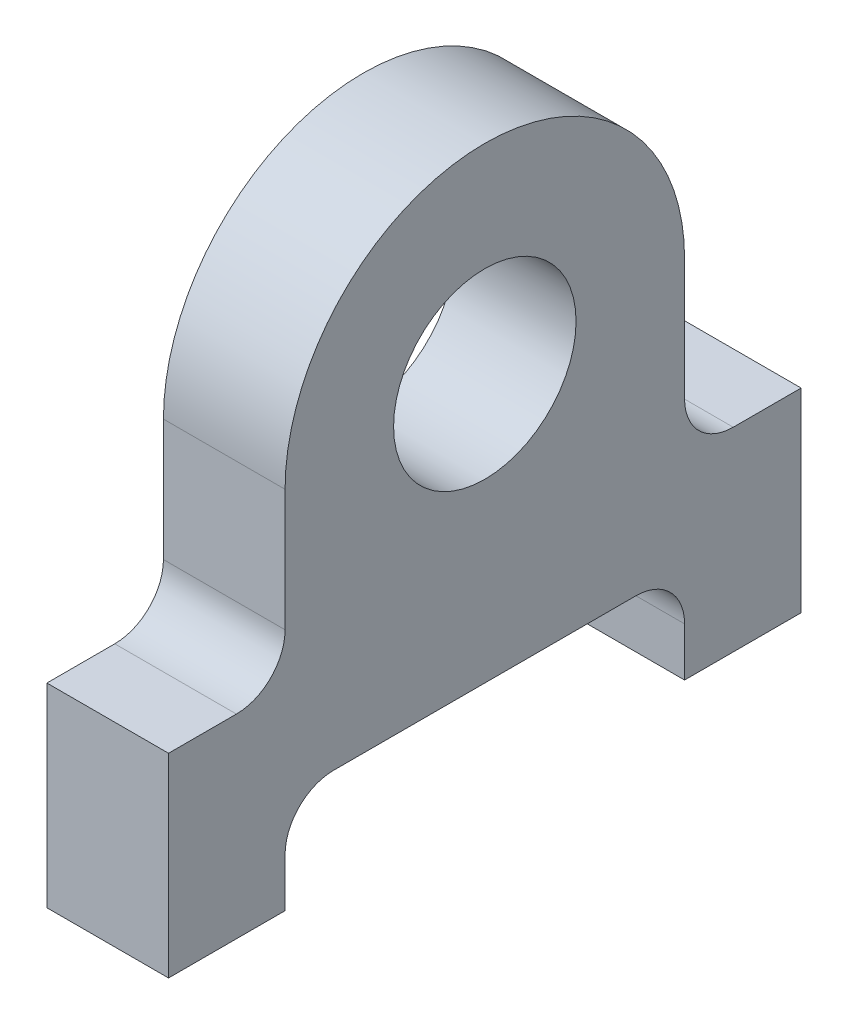
ISO-10303-21;
HEADER;
FILE_DESCRIPTION(('STEP AP214'),'2;1');
FILE_NAME('part.step','',(''),(''),'','','');
FILE_SCHEMA(('AUTOMOTIVE_DESIGN { 1 0 10303 214 1 1 1 1 }'));
ENDSEC;
DATA;
#1=APPLICATION_CONTEXT('core data for automotive mechanical design processes');
#2=APPLICATION_PROTOCOL_DEFINITION('international standard','automotive_design',2000,#1);
#3=PRODUCT_CONTEXT('',#1,'mechanical');
#4=PRODUCT('Part','Part','',(#3));
#5=PRODUCT_RELATED_PRODUCT_CATEGORY('part','',(#4));
#6=PRODUCT_DEFINITION_FORMATION('','',#4);
#7=PRODUCT_DEFINITION_CONTEXT('part definition',#1,'design');
#8=PRODUCT_DEFINITION('design','',#6,#7);
#9=PRODUCT_DEFINITION_SHAPE('','',#8);
#10=(LENGTH_UNIT() NAMED_UNIT(*) SI_UNIT(.MILLI.,.METRE.));
#11=(NAMED_UNIT(*) PLANE_ANGLE_UNIT() SI_UNIT($,.RADIAN.));
#12=(NAMED_UNIT(*) SI_UNIT($,.STERADIAN.) SOLID_ANGLE_UNIT());
#13=UNCERTAINTY_MEASURE_WITH_UNIT(LENGTH_MEASURE(1.E-05),#10,'distance_accuracy_value','');
#14=(GEOMETRIC_REPRESENTATION_CONTEXT(3) GLOBAL_UNCERTAINTY_ASSIGNED_CONTEXT((#13)) GLOBAL_UNIT_ASSIGNED_CONTEXT((#10,
#11,#12)) REPRESENTATION_CONTEXT('',''));
#15=CARTESIAN_POINT('',(0.,0.,0.));
#16=DIRECTION('',(0.,0.,1.));
#17=DIRECTION('',(1.,0.,0.));
#18=AXIS2_PLACEMENT_3D('',#15,#16,#17);
#19=CARTESIAN_POINT('',(6.35,-16.51,7.8867));
#20=DIRECTION('',(-1.,0.,0.));
#21=DIRECTION('',(0.,0.,1.));
#22=AXIS2_PLACEMENT_3D('',#19,#20,#21);
#23=PLANE('',#22);
#24=DIRECTION('',(0.,-1.,0.));
#25=VECTOR('',#24,1.);
#26=CARTESIAN_POINT('',(6.35,-8.89,16.51));
#27=LINE('',#26,#25);
#28=CARTESIAN_POINT('',(6.35,-8.89,16.51));
#29=VERTEX_POINT('',#28);
#30=CARTESIAN_POINT('',(6.35,-19.05,16.51));
#31=VERTEX_POINT('',#30);
#32=EDGE_CURVE('E236',#29,#31,#27,.T.);
#33=ORIENTED_EDGE('',*,*,#32,.T.);
#34=DIRECTION('',(0.,0.,-1.));
#35=VECTOR('',#34,1.);
#36=CARTESIAN_POINT('',(6.35,-19.05,16.51));
#37=LINE('',#36,#35);
#38=CARTESIAN_POINT('',(6.35,-19.05,10.4267));
#39=VERTEX_POINT('',#38);
#40=EDGE_CURVE('E124',#31,#39,#37,.T.);
#41=ORIENTED_EDGE('',*,*,#40,.T.);
#42=DIRECTION('',(0.,1.,0.));
#43=VECTOR('',#42,1.);
#44=CARTESIAN_POINT('',(6.35,-19.05,10.4267));
#45=LINE('',#44,#43);
#46=CARTESIAN_POINT('',(6.35,-16.51,10.4267));
#47=VERTEX_POINT('',#46);
#48=EDGE_CURVE('E289',#39,#47,#45,.T.);
#49=ORIENTED_EDGE('',*,*,#48,.T.);
#50=CARTESIAN_POINT('',(6.35,-16.51,7.8867));
#51=DIRECTION('',(-1.,0.,0.));
#52=DIRECTION('',(0.,0.,1.));
#53=AXIS2_PLACEMENT_3D('',#50,#51,#52);
#54=CIRCLE('',#53,2.54);
#55=CARTESIAN_POINT('',(6.35,-13.97,7.8867));
#56=VERTEX_POINT('',#55);
#57=EDGE_CURVE('E309',#47,#56,#54,.T.);
#58=ORIENTED_EDGE('',*,*,#57,.T.);
#59=DIRECTION('',(0.,0.,-1.));
#60=VECTOR('',#59,1.);
#61=CARTESIAN_POINT('',(6.35,-13.97,7.8867));
#62=LINE('',#61,#60);
#63=CARTESIAN_POINT('',(6.35,-13.97,-7.8867));
#64=VERTEX_POINT('',#63);
#65=EDGE_CURVE('E305',#56,#64,#62,.T.);
#66=ORIENTED_EDGE('',*,*,#65,.T.);
#67=CARTESIAN_POINT('',(6.35,-16.51,-7.8867));
#68=DIRECTION('',(-1.,0.,0.));
#69=DIRECTION('',(0.,0.,-1.));
#70=AXIS2_PLACEMENT_3D('',#67,#68,#69);
#71=CIRCLE('',#70,2.54);
#72=CARTESIAN_POINT('',(6.35,-16.51,-10.4267));
#73=VERTEX_POINT('',#72);
#74=EDGE_CURVE('E308',#64,#73,#71,.T.);
#75=ORIENTED_EDGE('',*,*,#74,.T.);
#76=DIRECTION('',(0.,-1.,0.));
#77=VECTOR('',#76,1.);
#78=CARTESIAN_POINT('',(6.35,-19.05,-10.4267));
#79=LINE('',#78,#77);
#80=CARTESIAN_POINT('',(6.35,-19.05,-10.4267));
#81=VERTEX_POINT('',#80);
#82=EDGE_CURVE('E313',#73,#81,#79,.T.);
#83=ORIENTED_EDGE('',*,*,#82,.T.);
#84=DIRECTION('',(0.,0.,-1.));
#85=VECTOR('',#84,1.);
#86=CARTESIAN_POINT('',(6.35,-19.05,-16.51));
#87=LINE('',#86,#85);
#88=CARTESIAN_POINT('',(6.35,-19.05,-16.51));
#89=VERTEX_POINT('',#88);
#90=EDGE_CURVE('E320',#81,#89,#87,.T.);
#91=ORIENTED_EDGE('',*,*,#90,.T.);
#92=DIRECTION('',(0.,1.,0.));
#93=VECTOR('',#92,1.);
#94=CARTESIAN_POINT('',(6.35,-8.89,-16.51));
#95=LINE('',#94,#93);
#96=CARTESIAN_POINT('',(6.35,-8.89,-16.51));
#97=VERTEX_POINT('',#96);
#98=EDGE_CURVE('E323',#89,#97,#95,.T.);
#99=ORIENTED_EDGE('',*,*,#98,.T.);
#100=DIRECTION('',(0.,0.,1.));
#101=VECTOR('',#100,1.);
#102=CARTESIAN_POINT('',(6.35,-8.89,-12.9667));
#103=LINE('',#102,#101);
#104=CARTESIAN_POINT('',(6.35,-8.89,-12.9667));
#105=VERTEX_POINT('',#104);
#106=EDGE_CURVE('E326',#97,#105,#103,.T.);
#107=ORIENTED_EDGE('',*,*,#106,.T.);
#108=CARTESIAN_POINT('',(6.35,-6.35,-12.9667));
#109=DIRECTION('',(-1.,0.,0.));
#110=DIRECTION('',(0.,0.,-1.));
#111=AXIS2_PLACEMENT_3D('',#108,#109,#110);
#112=CIRCLE('',#111,2.54);
#113=CARTESIAN_POINT('',(6.35,-6.35,-10.4267));
#114=VERTEX_POINT('',#113);
#115=EDGE_CURVE('E329',#105,#114,#112,.T.);
#116=ORIENTED_EDGE('',*,*,#115,.T.);
#117=DIRECTION('',(0.,1.,0.));
#118=VECTOR('',#117,1.);
#119=CARTESIAN_POINT('',(6.35,0.,-10.4267));
#120=LINE('',#119,#118);
#121=CARTESIAN_POINT('',(6.35,0.,-10.4267));
#122=VERTEX_POINT('',#121);
#123=EDGE_CURVE('E332',#114,#122,#120,.T.);
#124=ORIENTED_EDGE('',*,*,#123,.T.);
#125=CARTESIAN_POINT('',(6.35,0.,0.));
#126=DIRECTION('',(1.,0.,0.));
#127=DIRECTION('',(0.,0.,-1.));
#128=AXIS2_PLACEMENT_3D('',#125,#126,#127);
#129=CIRCLE('',#128,10.4267);
#130=CARTESIAN_POINT('',(6.35,0.,10.4267));
#131=VERTEX_POINT('',#130);
#132=EDGE_CURVE('E167',#122,#131,#129,.T.);
#133=ORIENTED_EDGE('',*,*,#132,.T.);
#134=DIRECTION('',(0.,-1.,0.));
#135=VECTOR('',#134,1.);
#136=CARTESIAN_POINT('',(6.35,0.,10.4267));
#137=LINE('',#136,#135);
#138=CARTESIAN_POINT('',(6.35,-6.35,10.4267));
#139=VERTEX_POINT('',#138);
#140=EDGE_CURVE('E161',#131,#139,#137,.T.);
#141=ORIENTED_EDGE('',*,*,#140,.T.);
#142=CARTESIAN_POINT('',(6.35,-6.35,12.9667));
#143=DIRECTION('',(-1.,0.,0.));
#144=DIRECTION('',(0.,0.,1.));
#145=AXIS2_PLACEMENT_3D('',#142,#143,#144);
#146=CIRCLE('',#145,2.54);
#147=CARTESIAN_POINT('',(6.35,-8.89,12.9667));
#148=VERTEX_POINT('',#147);
#149=EDGE_CURVE('E165',#139,#148,#146,.T.);
#150=ORIENTED_EDGE('',*,*,#149,.T.);
#151=DIRECTION('',(0.,0.,1.));
#152=VECTOR('',#151,1.);
#153=CARTESIAN_POINT('',(6.35,-8.89,12.9667));
#154=LINE('',#153,#152);
#155=EDGE_CURVE('E57',#148,#29,#154,.T.);
#156=ORIENTED_EDGE('',*,*,#155,.T.);
#157=EDGE_LOOP('',(#33,#41,#49,#58,#66,#75,#83,#91,#99,#107,#116,#124,#133,#141,#150,#156));
#158=FACE_BOUND('',#157,.T.);
#159=CARTESIAN_POINT('',(6.35,0.,0.));
#160=DIRECTION('',(1.,0.,0.));
#161=DIRECTION('',(0.,0.,1.));
#162=AXIS2_PLACEMENT_3D('',#159,#160,#161);
#163=CIRCLE('',#162,4.7625);
#164=CARTESIAN_POINT('',(6.35,0.,4.7625));
#165=VERTEX_POINT('',#164);
#166=EDGE_CURVE('E194',#165,#165,#163,.T.);
#167=ORIENTED_EDGE('',*,*,#166,.F.);
#168=EDGE_LOOP('',(#167));
#169=FACE_BOUND('',#168,.T.);
#170=ADVANCED_FACE('F39',(#158,#169),#23,.F.);
#171=CARTESIAN_POINT('',(0.,-16.51,7.8867));
#172=DIRECTION('',(-1.,0.,0.));
#173=DIRECTION('',(0.,0.,1.));
#174=AXIS2_PLACEMENT_3D('',#171,#172,#173);
#175=PLANE('',#174);
#176=DIRECTION('',(0.,-1.,0.));
#177=VECTOR('',#176,1.);
#178=CARTESIAN_POINT('',(0.,-8.89,16.51));
#179=LINE('',#178,#177);
#180=CARTESIAN_POINT('',(0.,-8.89,16.51));
#181=VERTEX_POINT('',#180);
#182=CARTESIAN_POINT('',(0.,-19.05,16.51));
#183=VERTEX_POINT('',#182);
#184=EDGE_CURVE('E189',#181,#183,#179,.T.);
#185=ORIENTED_EDGE('',*,*,#184,.F.);
#186=DIRECTION('',(0.,0.,1.));
#187=VECTOR('',#186,1.);
#188=CARTESIAN_POINT('',(0.,-8.89,12.9667));
#189=LINE('',#188,#187);
#190=CARTESIAN_POINT('',(0.,-8.89,12.9667));
#191=VERTEX_POINT('',#190);
#192=EDGE_CURVE('E116',#191,#181,#189,.T.);
#193=ORIENTED_EDGE('',*,*,#192,.F.);
#194=CARTESIAN_POINT('',(0.,-6.35,12.9667));
#195=DIRECTION('',(-1.,0.,0.));
#196=DIRECTION('',(0.,0.,1.));
#197=AXIS2_PLACEMENT_3D('',#194,#195,#196);
#198=CIRCLE('',#197,2.54);
#199=CARTESIAN_POINT('',(0.,-6.35,10.4267));
#200=VERTEX_POINT('',#199);
#201=EDGE_CURVE('E110',#200,#191,#198,.T.);
#202=ORIENTED_EDGE('',*,*,#201,.F.);
#203=DIRECTION('',(0.,-1.,0.));
#204=VECTOR('',#203,1.);
#205=CARTESIAN_POINT('',(0.,0.,10.4267));
#206=LINE('',#205,#204);
#207=CARTESIAN_POINT('',(0.,0.,10.4267));
#208=VERTEX_POINT('',#207);
#209=EDGE_CURVE('E176',#208,#200,#206,.T.);
#210=ORIENTED_EDGE('',*,*,#209,.F.);
#211=CARTESIAN_POINT('',(0.,0.,0.));
#212=DIRECTION('',(1.,0.,0.));
#213=DIRECTION('',(0.,0.,-1.));
#214=AXIS2_PLACEMENT_3D('',#211,#212,#213);
#215=CIRCLE('',#214,10.4267);
#216=CARTESIAN_POINT('',(0.,0.,-10.4267));
#217=VERTEX_POINT('',#216);
#218=EDGE_CURVE('E227',#217,#208,#215,.T.);
#219=ORIENTED_EDGE('',*,*,#218,.F.);
#220=DIRECTION('',(0.,1.,0.));
#221=VECTOR('',#220,1.);
#222=CARTESIAN_POINT('',(0.,0.,-10.4267));
#223=LINE('',#222,#221);
#224=CARTESIAN_POINT('',(0.,-6.35,-10.4267));
#225=VERTEX_POINT('',#224);
#226=EDGE_CURVE('E224',#225,#217,#223,.T.);
#227=ORIENTED_EDGE('',*,*,#226,.F.);
#228=CARTESIAN_POINT('',(0.,-6.35,-12.9667));
#229=DIRECTION('',(-1.,0.,0.));
#230=DIRECTION('',(0.,0.,-1.));
#231=AXIS2_PLACEMENT_3D('',#228,#229,#230);
#232=CIRCLE('',#231,2.54);
#233=CARTESIAN_POINT('',(0.,-8.89,-12.9667));
#234=VERTEX_POINT('',#233);
#235=EDGE_CURVE('E221',#234,#225,#232,.T.);
#236=ORIENTED_EDGE('',*,*,#235,.F.);
#237=DIRECTION('',(0.,0.,1.));
#238=VECTOR('',#237,1.);
#239=CARTESIAN_POINT('',(0.,-8.89,-12.9667));
#240=LINE('',#239,#238);
#241=CARTESIAN_POINT('',(0.,-8.89,-16.51));
#242=VERTEX_POINT('',#241);
#243=EDGE_CURVE('E218',#242,#234,#240,.T.);
#244=ORIENTED_EDGE('',*,*,#243,.F.);
#245=DIRECTION('',(0.,1.,0.));
#246=VECTOR('',#245,1.);
#247=CARTESIAN_POINT('',(0.,-8.89,-16.51));
#248=LINE('',#247,#246);
#249=CARTESIAN_POINT('',(0.,-19.05,-16.51));
#250=VERTEX_POINT('',#249);
#251=EDGE_CURVE('E215',#250,#242,#248,.T.);
#252=ORIENTED_EDGE('',*,*,#251,.F.);
#253=DIRECTION('',(0.,0.,-1.));
#254=VECTOR('',#253,1.);
#255=CARTESIAN_POINT('',(0.,-19.05,-16.51));
#256=LINE('',#255,#254);
#257=CARTESIAN_POINT('',(0.,-19.05,-10.4267));
#258=VERTEX_POINT('',#257);
#259=EDGE_CURVE('E212',#258,#250,#256,.T.);
#260=ORIENTED_EDGE('',*,*,#259,.F.);
#261=DIRECTION('',(0.,-1.,0.));
#262=VECTOR('',#261,1.);
#263=CARTESIAN_POINT('',(0.,-19.05,-10.4267));
#264=LINE('',#263,#262);
#265=CARTESIAN_POINT('',(0.,-16.51,-10.4267));
#266=VERTEX_POINT('',#265);
#267=EDGE_CURVE('E209',#266,#258,#264,.T.);
#268=ORIENTED_EDGE('',*,*,#267,.F.);
#269=CARTESIAN_POINT('',(0.,-16.51,-7.8867));
#270=DIRECTION('',(-1.,0.,0.));
#271=DIRECTION('',(0.,0.,-1.));
#272=AXIS2_PLACEMENT_3D('',#269,#270,#271);
#273=CIRCLE('',#272,2.54);
#274=CARTESIAN_POINT('',(0.,-13.97,-7.8867));
#275=VERTEX_POINT('',#274);
#276=EDGE_CURVE('E206',#275,#266,#273,.T.);
#277=ORIENTED_EDGE('',*,*,#276,.F.);
#278=DIRECTION('',(0.,0.,-1.));
#279=VECTOR('',#278,1.);
#280=CARTESIAN_POINT('',(0.,-13.97,7.8867));
#281=LINE('',#280,#279);
#282=CARTESIAN_POINT('',(0.,-13.97,7.8867));
#283=VERTEX_POINT('',#282);
#284=EDGE_CURVE('E203',#283,#275,#281,.T.);
#285=ORIENTED_EDGE('',*,*,#284,.F.);
#286=CARTESIAN_POINT('',(0.,-16.51,7.8867));
#287=DIRECTION('',(-1.,0.,0.));
#288=DIRECTION('',(0.,0.,1.));
#289=AXIS2_PLACEMENT_3D('',#286,#287,#288);
#290=CIRCLE('',#289,2.54);
#291=CARTESIAN_POINT('',(0.,-16.51,10.4267));
#292=VERTEX_POINT('',#291);
#293=EDGE_CURVE('E200',#292,#283,#290,.T.);
#294=ORIENTED_EDGE('',*,*,#293,.F.);
#295=DIRECTION('',(0.,1.,0.));
#296=VECTOR('',#295,1.);
#297=CARTESIAN_POINT('',(0.,-19.05,10.4267));
#298=LINE('',#297,#296);
#299=CARTESIAN_POINT('',(0.,-19.05,10.4267));
#300=VERTEX_POINT('',#299);
#301=EDGE_CURVE('E197',#300,#292,#298,.T.);
#302=ORIENTED_EDGE('',*,*,#301,.F.);
#303=DIRECTION('',(0.,0.,-1.));
#304=VECTOR('',#303,1.);
#305=CARTESIAN_POINT('',(0.,-19.05,16.51));
#306=LINE('',#305,#304);
#307=EDGE_CURVE('E193',#183,#300,#306,.T.);
#308=ORIENTED_EDGE('',*,*,#307,.F.);
#309=EDGE_LOOP('',(#185,#193,#202,#210,#219,#227,#236,#244,#252,#260,#268,#277,#285,#294,#302,#308));
#310=FACE_BOUND('',#309,.T.);
#311=CARTESIAN_POINT('',(0.,0.,0.));
#312=DIRECTION('',(1.,0.,0.));
#313=DIRECTION('',(0.,0.,1.));
#314=AXIS2_PLACEMENT_3D('',#311,#312,#313);
#315=CIRCLE('',#314,4.7625);
#316=CARTESIAN_POINT('',(0.,0.,4.7625));
#317=VERTEX_POINT('',#316);
#318=EDGE_CURVE('E533',#317,#317,#315,.T.);
#319=ORIENTED_EDGE('',*,*,#318,.T.);
#320=EDGE_LOOP('',(#319));
#321=FACE_BOUND('',#320,.T.);
#322=ADVANCED_FACE('F293',(#310,#321),#175,.T.);
#323=CARTESIAN_POINT('',(6.35,-8.89,16.51));
#324=DIRECTION('',(0.,0.,-1.));
#325=DIRECTION('',(-1.,0.,0.));
#326=AXIS2_PLACEMENT_3D('',#323,#324,#325);
#327=PLANE('',#326);
#328=ORIENTED_EDGE('',*,*,#184,.T.);
#329=DIRECTION('',(-1.,0.,0.));
#330=VECTOR('',#329,1.);
#331=CARTESIAN_POINT('',(6.35,-19.05,16.51));
#332=LINE('',#331,#330);
#333=EDGE_CURVE('E11',#31,#183,#332,.T.);
#334=ORIENTED_EDGE('',*,*,#333,.F.);
#335=ORIENTED_EDGE('',*,*,#32,.F.);
#336=DIRECTION('',(-1.,0.,0.));
#337=VECTOR('',#336,1.);
#338=CARTESIAN_POINT('',(6.35,-8.89,16.51));
#339=LINE('',#338,#337);
#340=EDGE_CURVE('E185',#29,#181,#339,.T.);
#341=ORIENTED_EDGE('',*,*,#340,.T.);
#342=EDGE_LOOP('',(#328,#334,#335,#341));
#343=FACE_BOUND('',#342,.T.);
#344=ADVANCED_FACE('F41',(#343),#327,.F.);
#345=CARTESIAN_POINT('',(6.35,-19.05,16.51));
#346=DIRECTION('',(0.,1.,0.));
#347=DIRECTION('',(0.,0.,1.));
#348=AXIS2_PLACEMENT_3D('',#345,#346,#347);
#349=PLANE('',#348);
#350=ORIENTED_EDGE('',*,*,#307,.T.);
#351=DIRECTION('',(-1.,0.,0.));
#352=VECTOR('',#351,1.);
#353=CARTESIAN_POINT('',(6.35,-19.05,10.4267));
#354=LINE('',#353,#352);
#355=EDGE_CURVE('E49',#39,#300,#354,.T.);
#356=ORIENTED_EDGE('',*,*,#355,.F.);
#357=ORIENTED_EDGE('',*,*,#40,.F.);
#358=ORIENTED_EDGE('',*,*,#333,.T.);
#359=EDGE_LOOP('',(#350,#356,#357,#358));
#360=FACE_BOUND('',#359,.T.);
#361=ADVANCED_FACE('F368',(#360),#349,.F.);
#362=CARTESIAN_POINT('',(6.35,-19.05,10.4267));
#363=DIRECTION('',(0.,0.,1.));
#364=DIRECTION('',(0.,-1.,0.));
#365=AXIS2_PLACEMENT_3D('',#362,#363,#364);
#366=PLANE('',#365);
#367=ORIENTED_EDGE('',*,*,#301,.T.);
#368=DIRECTION('',(-1.,0.,0.));
#369=VECTOR('',#368,1.);
#370=CARTESIAN_POINT('',(6.35,-16.51,10.4267));
#371=LINE('',#370,#369);
#372=EDGE_CURVE('E279',#47,#292,#371,.T.);
#373=ORIENTED_EDGE('',*,*,#372,.F.);
#374=ORIENTED_EDGE('',*,*,#48,.F.);
#375=ORIENTED_EDGE('',*,*,#355,.T.);
#376=EDGE_LOOP('',(#367,#373,#374,#375));
#377=FACE_BOUND('',#376,.T.);
#378=ADVANCED_FACE('F287',(#377),#366,.F.);
#379=CARTESIAN_POINT('',(6.35,-16.51,7.8867));
#380=DIRECTION('',(-1.,0.,0.));
#381=DIRECTION('',(0.,0.,1.));
#382=AXIS2_PLACEMENT_3D('',#379,#380,#381);
#383=CYLINDRICAL_SURFACE('',#382,2.54);
#384=ORIENTED_EDGE('',*,*,#293,.T.);
#385=DIRECTION('',(-1.,0.,0.));
#386=VECTOR('',#385,1.);
#387=CARTESIAN_POINT('',(6.35,-13.97,7.8867));
#388=LINE('',#387,#386);
#389=EDGE_CURVE('E275',#56,#283,#388,.T.);
#390=ORIENTED_EDGE('',*,*,#389,.F.);
#391=ORIENTED_EDGE('',*,*,#57,.F.);
#392=ORIENTED_EDGE('',*,*,#372,.T.);
#393=EDGE_LOOP('',(#384,#390,#391,#392));
#394=FACE_BOUND('',#393,.T.);
#395=ADVANCED_FACE('F299',(#394),#383,.F.);
#396=CARTESIAN_POINT('',(6.35,-13.97,7.8867));
#397=DIRECTION('',(0.,1.,0.));
#398=DIRECTION('',(0.,0.,1.));
#399=AXIS2_PLACEMENT_3D('',#396,#397,#398);
#400=PLANE('',#399);
#401=ORIENTED_EDGE('',*,*,#284,.T.);
#402=DIRECTION('',(-1.,0.,0.));
#403=VECTOR('',#402,1.);
#404=CARTESIAN_POINT('',(6.35,-13.97,-7.8867));
#405=LINE('',#404,#403);
#406=EDGE_CURVE('E271',#64,#275,#405,.T.);
#407=ORIENTED_EDGE('',*,*,#406,.F.);
#408=ORIENTED_EDGE('',*,*,#65,.F.);
#409=ORIENTED_EDGE('',*,*,#389,.T.);
#410=EDGE_LOOP('',(#401,#407,#408,#409));
#411=FACE_BOUND('',#410,.T.);
#412=ADVANCED_FACE('F303',(#411),#400,.F.);
#413=CARTESIAN_POINT('',(6.35,-16.51,-7.8867));
#414=DIRECTION('',(-1.,0.,0.));
#415=DIRECTION('',(0.,0.,1.));
#416=AXIS2_PLACEMENT_3D('',#413,#414,#415);
#417=CYLINDRICAL_SURFACE('',#416,2.54);
#418=ORIENTED_EDGE('',*,*,#276,.T.);
#419=DIRECTION('',(-1.,0.,0.));
#420=VECTOR('',#419,1.);
#421=CARTESIAN_POINT('',(6.35,-16.51,-10.4267));
#422=LINE('',#421,#420);
#423=EDGE_CURVE('E267',#73,#266,#422,.T.);
#424=ORIENTED_EDGE('',*,*,#423,.F.);
#425=ORIENTED_EDGE('',*,*,#74,.F.);
#426=ORIENTED_EDGE('',*,*,#406,.T.);
#427=EDGE_LOOP('',(#418,#424,#425,#426));
#428=FACE_BOUND('',#427,.T.);
#429=ADVANCED_FACE('F381',(#428),#417,.F.);
#430=CARTESIAN_POINT('',(6.35,-19.05,-10.4267));
#431=DIRECTION('',(0.,0.,-1.));
#432=DIRECTION('',(0.,1.,0.));
#433=AXIS2_PLACEMENT_3D('',#430,#431,#432);
#434=PLANE('',#433);
#435=ORIENTED_EDGE('',*,*,#267,.T.);
#436=DIRECTION('',(-1.,0.,0.));
#437=VECTOR('',#436,1.);
#438=CARTESIAN_POINT('',(6.35,-19.05,-10.4267));
#439=LINE('',#438,#437);
#440=EDGE_CURVE('E263',#81,#258,#439,.T.);
#441=ORIENTED_EDGE('',*,*,#440,.F.);
#442=ORIENTED_EDGE('',*,*,#82,.F.);
#443=ORIENTED_EDGE('',*,*,#423,.T.);
#444=EDGE_LOOP('',(#435,#441,#442,#443));
#445=FACE_BOUND('',#444,.T.);
#446=ADVANCED_FACE('F384',(#445),#434,.F.);
#447=CARTESIAN_POINT('',(6.35,-19.05,-16.51));
#448=DIRECTION('',(0.,1.,0.));
#449=DIRECTION('',(0.,0.,1.));
#450=AXIS2_PLACEMENT_3D('',#447,#448,#449);
#451=PLANE('',#450);
#452=ORIENTED_EDGE('',*,*,#259,.T.);
#453=DIRECTION('',(-1.,0.,0.));
#454=VECTOR('',#453,1.);
#455=CARTESIAN_POINT('',(6.35,-19.05,-16.51));
#456=LINE('',#455,#454);
#457=EDGE_CURVE('E259',#89,#250,#456,.T.);
#458=ORIENTED_EDGE('',*,*,#457,.F.);
#459=ORIENTED_EDGE('',*,*,#90,.F.);
#460=ORIENTED_EDGE('',*,*,#440,.T.);
#461=EDGE_LOOP('',(#452,#458,#459,#460));
#462=FACE_BOUND('',#461,.T.);
#463=ADVANCED_FACE('F388',(#462),#451,.F.);
#464=CARTESIAN_POINT('',(6.35,-8.89,-16.51));
#465=DIRECTION('',(0.,0.,1.));
#466=DIRECTION('',(1.,0.,0.));
#467=AXIS2_PLACEMENT_3D('',#464,#465,#466);
#468=PLANE('',#467);
#469=ORIENTED_EDGE('',*,*,#251,.T.);
#470=DIRECTION('',(-1.,0.,0.));
#471=VECTOR('',#470,1.);
#472=CARTESIAN_POINT('',(6.35,-8.89,-16.51));
#473=LINE('',#472,#471);
#474=EDGE_CURVE('E255',#97,#242,#473,.T.);
#475=ORIENTED_EDGE('',*,*,#474,.F.);
#476=ORIENTED_EDGE('',*,*,#98,.F.);
#477=ORIENTED_EDGE('',*,*,#457,.T.);
#478=EDGE_LOOP('',(#469,#475,#476,#477));
#479=FACE_BOUND('',#478,.T.);
#480=ADVANCED_FACE('F392',(#479),#468,.F.);
#481=CARTESIAN_POINT('',(6.35,-8.89,-12.9667));
#482=DIRECTION('',(0.,-1.,0.));
#483=DIRECTION('',(0.,0.,-1.));
#484=AXIS2_PLACEMENT_3D('',#481,#482,#483);
#485=PLANE('',#484);
#486=ORIENTED_EDGE('',*,*,#243,.T.);
#487=DIRECTION('',(-1.,0.,0.));
#488=VECTOR('',#487,1.);
#489=CARTESIAN_POINT('',(6.35,-8.89,-12.9667));
#490=LINE('',#489,#488);
#491=EDGE_CURVE('E251',#105,#234,#490,.T.);
#492=ORIENTED_EDGE('',*,*,#491,.F.);
#493=ORIENTED_EDGE('',*,*,#106,.F.);
#494=ORIENTED_EDGE('',*,*,#474,.T.);
#495=EDGE_LOOP('',(#486,#492,#493,#494));
#496=FACE_BOUND('',#495,.T.);
#497=ADVANCED_FACE('F396',(#496),#485,.F.);
#498=CARTESIAN_POINT('',(6.35,-6.35,-12.9667));
#499=DIRECTION('',(-1.,0.,0.));
#500=DIRECTION('',(0.,0.,1.));
#501=AXIS2_PLACEMENT_3D('',#498,#499,#500);
#502=CYLINDRICAL_SURFACE('',#501,2.54);
#503=ORIENTED_EDGE('',*,*,#235,.T.);
#504=DIRECTION('',(-1.,0.,0.));
#505=VECTOR('',#504,1.);
#506=CARTESIAN_POINT('',(6.35,-6.35,-10.4267));
#507=LINE('',#506,#505);
#508=EDGE_CURVE('E247',#114,#225,#507,.T.);
#509=ORIENTED_EDGE('',*,*,#508,.F.);
#510=ORIENTED_EDGE('',*,*,#115,.F.);
#511=ORIENTED_EDGE('',*,*,#491,.T.);
#512=EDGE_LOOP('',(#503,#509,#510,#511));
#513=FACE_BOUND('',#512,.T.);
#514=ADVANCED_FACE('F400',(#513),#502,.F.);
#515=CARTESIAN_POINT('',(6.35,0.,-10.4267));
#516=DIRECTION('',(0.,0.,1.));
#517=DIRECTION('',(0.,-1.,0.));
#518=AXIS2_PLACEMENT_3D('',#515,#516,#517);
#519=PLANE('',#518);
#520=ORIENTED_EDGE('',*,*,#226,.T.);
#521=DIRECTION('',(-1.,0.,0.));
#522=VECTOR('',#521,1.);
#523=CARTESIAN_POINT('',(6.35,0.,-10.4267));
#524=LINE('',#523,#522);
#525=EDGE_CURVE('E243',#122,#217,#524,.T.);
#526=ORIENTED_EDGE('',*,*,#525,.F.);
#527=ORIENTED_EDGE('',*,*,#123,.F.);
#528=ORIENTED_EDGE('',*,*,#508,.T.);
#529=EDGE_LOOP('',(#520,#526,#527,#528));
#530=FACE_BOUND('',#529,.T.);
#531=ADVANCED_FACE('F340',(#530),#519,.F.);
#532=CARTESIAN_POINT('',(6.35,0.,0.));
#533=DIRECTION('',(-1.,0.,0.));
#534=DIRECTION('',(0.,0.,1.));
#535=AXIS2_PLACEMENT_3D('',#532,#533,#534);
#536=CYLINDRICAL_SURFACE('',#535,10.4267);
#537=ORIENTED_EDGE('',*,*,#218,.T.);
#538=DIRECTION('',(-1.,0.,0.));
#539=VECTOR('',#538,1.);
#540=CARTESIAN_POINT('',(6.35,0.,10.4267));
#541=LINE('',#540,#539);
#542=EDGE_CURVE('E178',#131,#208,#541,.T.);
#543=ORIENTED_EDGE('',*,*,#542,.F.);
#544=ORIENTED_EDGE('',*,*,#132,.F.);
#545=ORIENTED_EDGE('',*,*,#525,.T.);
#546=EDGE_LOOP('',(#537,#543,#544,#545));
#547=FACE_BOUND('',#546,.T.);
#548=ADVANCED_FACE('F344',(#547),#536,.T.);
#549=CARTESIAN_POINT('',(6.35,0.,10.4267));
#550=DIRECTION('',(0.,0.,-1.));
#551=DIRECTION('',(-1.,0.,0.));
#552=AXIS2_PLACEMENT_3D('',#549,#550,#551);
#553=PLANE('',#552);
#554=ORIENTED_EDGE('',*,*,#209,.T.);
#555=DIRECTION('',(-1.,0.,0.));
#556=VECTOR('',#555,1.);
#557=CARTESIAN_POINT('',(6.35,-6.35,10.4267));
#558=LINE('',#557,#556);
#559=EDGE_CURVE('E173',#139,#200,#558,.T.);
#560=ORIENTED_EDGE('',*,*,#559,.F.);
#561=ORIENTED_EDGE('',*,*,#140,.F.);
#562=ORIENTED_EDGE('',*,*,#542,.T.);
#563=EDGE_LOOP('',(#554,#560,#561,#562));
#564=FACE_BOUND('',#563,.T.);
#565=ADVANCED_FACE('F174',(#564),#553,.F.);
#566=CARTESIAN_POINT('',(6.35,-6.35,12.9667));
#567=DIRECTION('',(-1.,0.,0.));
#568=DIRECTION('',(0.,0.,1.));
#569=AXIS2_PLACEMENT_3D('',#566,#567,#568);
#570=CYLINDRICAL_SURFACE('',#569,2.54);
#571=ORIENTED_EDGE('',*,*,#201,.T.);
#572=DIRECTION('',(-1.,0.,0.));
#573=VECTOR('',#572,1.);
#574=CARTESIAN_POINT('',(6.35,-8.89,12.9667));
#575=LINE('',#574,#573);
#576=EDGE_CURVE('E179',#148,#191,#575,.T.);
#577=ORIENTED_EDGE('',*,*,#576,.F.);
#578=ORIENTED_EDGE('',*,*,#149,.F.);
#579=ORIENTED_EDGE('',*,*,#559,.T.);
#580=EDGE_LOOP('',(#571,#577,#578,#579));
#581=FACE_BOUND('',#580,.T.);
#582=ADVANCED_FACE('F181',(#581),#570,.F.);
#583=CARTESIAN_POINT('',(6.35,-8.89,12.9667));
#584=DIRECTION('',(0.,-1.,0.));
#585=DIRECTION('',(0.,0.,-1.));
#586=AXIS2_PLACEMENT_3D('',#583,#584,#585);
#587=PLANE('',#586);
#588=ORIENTED_EDGE('',*,*,#192,.T.);
#589=ORIENTED_EDGE('',*,*,#340,.F.);
#590=ORIENTED_EDGE('',*,*,#155,.F.);
#591=ORIENTED_EDGE('',*,*,#576,.T.);
#592=EDGE_LOOP('',(#588,#589,#590,#591));
#593=FACE_BOUND('',#592,.T.);
#594=ADVANCED_FACE('F348',(#593),#587,.F.);
#595=CARTESIAN_POINT('',(6.35,0.,0.));
#596=DIRECTION('',(-1.,0.,0.));
#597=DIRECTION('',(0.,0.,1.));
#598=AXIS2_PLACEMENT_3D('',#595,#596,#597);
#599=CYLINDRICAL_SURFACE('',#598,4.7625);
#600=ORIENTED_EDGE('',*,*,#166,.T.);
#601=EDGE_LOOP('',(#600));
#602=FACE_BOUND('',#601,.T.);
#603=ORIENTED_EDGE('',*,*,#318,.F.);
#604=EDGE_LOOP('',(#603));
#605=FACE_BOUND('',#604,.T.);
#606=ADVANCED_FACE('F350',(#602,#605),#599,.F.);
#607=CLOSED_SHELL('',(#170,#322,#344,#361,#378,#395,#412,#429,#446,#463,#480,#497,#514,#531,
#548,#565,#582,#594,#606));
#608=MANIFOLD_SOLID_BREP('B2',#607);
#609=ADVANCED_BREP_SHAPE_REPRESENTATION('',(#18,#608),#14);
#610=SHAPE_DEFINITION_REPRESENTATION(#9,#609);
ENDSEC;
END-ISO-10303-21;
